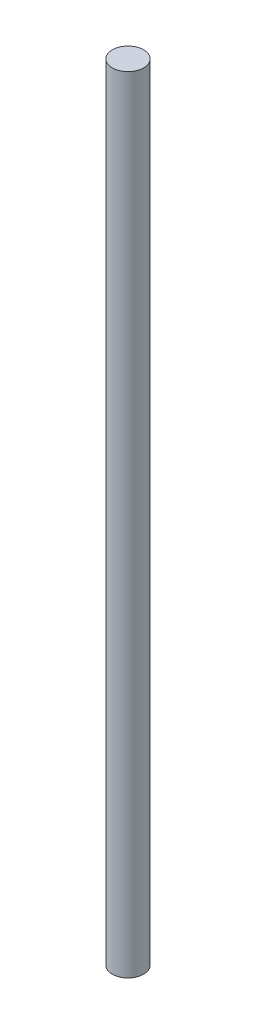
ISO-10303-21;
HEADER;
FILE_DESCRIPTION(('STEP AP214'),'2;1');
FILE_NAME('part.step','',(''),(''),'','','');
FILE_SCHEMA(('AUTOMOTIVE_DESIGN { 1 0 10303 214 1 1 1 1 }'));
ENDSEC;
DATA;
#1=APPLICATION_CONTEXT('core data for automotive mechanical design processes');
#2=APPLICATION_PROTOCOL_DEFINITION('international standard','automotive_design',2000,#1);
#3=PRODUCT_CONTEXT('',#1,'mechanical');
#4=PRODUCT('Part','Part','',(#3));
#5=PRODUCT_RELATED_PRODUCT_CATEGORY('part','',(#4));
#6=PRODUCT_DEFINITION_FORMATION('','',#4);
#7=PRODUCT_DEFINITION_CONTEXT('part definition',#1,'design');
#8=PRODUCT_DEFINITION('design','',#6,#7);
#9=PRODUCT_DEFINITION_SHAPE('','',#8);
#10=(LENGTH_UNIT() NAMED_UNIT(*) SI_UNIT(.MILLI.,.METRE.));
#11=(NAMED_UNIT(*) PLANE_ANGLE_UNIT() SI_UNIT($,.RADIAN.));
#12=(NAMED_UNIT(*) SI_UNIT($,.STERADIAN.) SOLID_ANGLE_UNIT());
#13=UNCERTAINTY_MEASURE_WITH_UNIT(LENGTH_MEASURE(1.E-05),#10,'distance_accuracy_value','');
#14=(GEOMETRIC_REPRESENTATION_CONTEXT(3) GLOBAL_UNCERTAINTY_ASSIGNED_CONTEXT((#13)) GLOBAL_UNIT_ASSIGNED_CONTEXT((#10,
#11,#12)) REPRESENTATION_CONTEXT('',''));
#15=CARTESIAN_POINT('',(0.,0.,0.));
#16=DIRECTION('',(0.,0.,1.));
#17=DIRECTION('',(1.,0.,0.));
#18=AXIS2_PLACEMENT_3D('',#15,#16,#17);
#19=CARTESIAN_POINT('',(0.,256.599391649101,0.));
#20=DIRECTION('',(0.,1.,0.));
#21=DIRECTION('',(0.,0.,1.));
#22=AXIS2_PLACEMENT_3D('',#19,#20,#21);
#23=CYLINDRICAL_SURFACE('',#22,7.99999999999993);
#24=CARTESIAN_POINT('',(0.,-200.,0.));
#25=DIRECTION('',(0.,1.,0.));
#26=DIRECTION('',(0.,0.,1.));
#27=AXIS2_PLACEMENT_3D('',#24,#25,#26);
#28=CIRCLE('',#27,7.99999999999993);
#29=CARTESIAN_POINT('',(0.,-200.,7.99999999999993));
#30=VERTEX_POINT('',#29);
#31=EDGE_CURVE('E37',#30,#30,#28,.T.);
#32=ORIENTED_EDGE('',*,*,#31,.T.);
#33=EDGE_LOOP('',(#32));
#34=FACE_BOUND('',#33,.T.);
#35=CARTESIAN_POINT('',(0.,200.,0.));
#36=DIRECTION('',(0.,1.,0.));
#37=DIRECTION('',(0.,0.,1.));
#38=AXIS2_PLACEMENT_3D('',#35,#36,#37);
#39=CIRCLE('',#38,7.99999999999993);
#40=CARTESIAN_POINT('',(0.,200.,7.99999999999993));
#41=VERTEX_POINT('',#40);
#42=EDGE_CURVE('E10',#41,#41,#39,.T.);
#43=ORIENTED_EDGE('',*,*,#42,.F.);
#44=EDGE_LOOP('',(#43));
#45=FACE_BOUND('',#44,.T.);
#46=ADVANCED_FACE('F31',(#34,#45),#23,.T.);
#47=CARTESIAN_POINT('',(-7.99999999999993,200.,0.));
#48=DIRECTION('',(0.,1.,0.));
#49=DIRECTION('',(0.,0.,1.));
#50=AXIS2_PLACEMENT_3D('',#47,#48,#49);
#51=PLANE('',#50);
#52=ORIENTED_EDGE('',*,*,#42,.T.);
#53=EDGE_LOOP('',(#52));
#54=FACE_BOUND('',#53,.T.);
#55=ADVANCED_FACE('F47',(#54),#51,.T.);
#56=CARTESIAN_POINT('',(-7.99999999999993,-200.,0.));
#57=DIRECTION('',(0.,-1.,0.));
#58=DIRECTION('',(0.,0.,-1.));
#59=AXIS2_PLACEMENT_3D('',#56,#57,#58);
#60=PLANE('',#59);
#61=ORIENTED_EDGE('',*,*,#31,.F.);
#62=EDGE_LOOP('',(#61));
#63=FACE_BOUND('',#62,.T.);
#64=ADVANCED_FACE('F45',(#63),#60,.T.);
#65=CLOSED_SHELL('',(#46,#55,#64));
#66=MANIFOLD_SOLID_BREP('B2',#65);
#67=ADVANCED_BREP_SHAPE_REPRESENTATION('',(#18,#66),#14);
#68=SHAPE_DEFINITION_REPRESENTATION(#9,#67);
ENDSEC;
END-ISO-10303-21;
